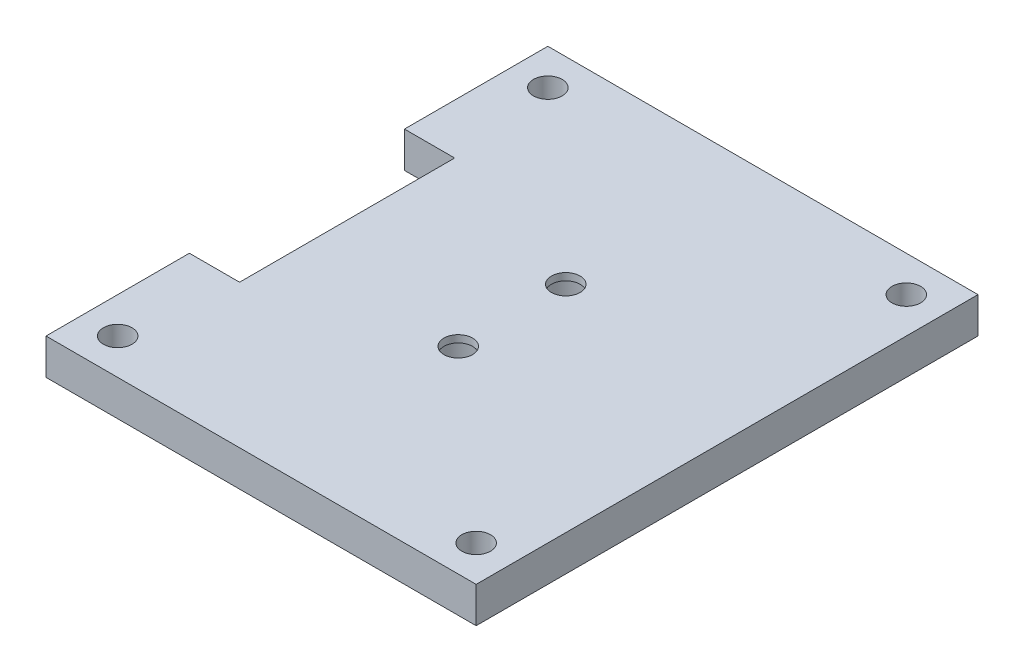
ISO-10303-21;
HEADER;
FILE_DESCRIPTION(('STEP AP214'),'2;1');
FILE_NAME('part.step','',(''),(''),'','','');
FILE_SCHEMA(('AUTOMOTIVE_DESIGN { 1 0 10303 214 1 1 1 1 }'));
ENDSEC;
DATA;
#1=APPLICATION_CONTEXT('core data for automotive mechanical design processes');
#2=APPLICATION_PROTOCOL_DEFINITION('international standard','automotive_design',2000,#1);
#3=PRODUCT_CONTEXT('',#1,'mechanical');
#4=PRODUCT('Part','Part','',(#3));
#5=PRODUCT_RELATED_PRODUCT_CATEGORY('part','',(#4));
#6=PRODUCT_DEFINITION_FORMATION('','',#4);
#7=PRODUCT_DEFINITION_CONTEXT('part definition',#1,'design');
#8=PRODUCT_DEFINITION('design','',#6,#7);
#9=PRODUCT_DEFINITION_SHAPE('','',#8);
#10=(LENGTH_UNIT() NAMED_UNIT(*) SI_UNIT(.MILLI.,.METRE.));
#11=(NAMED_UNIT(*) PLANE_ANGLE_UNIT() SI_UNIT($,.RADIAN.));
#12=(NAMED_UNIT(*) SI_UNIT($,.STERADIAN.) SOLID_ANGLE_UNIT());
#13=UNCERTAINTY_MEASURE_WITH_UNIT(LENGTH_MEASURE(1.E-05),#10,'distance_accuracy_value','');
#14=(GEOMETRIC_REPRESENTATION_CONTEXT(3) GLOBAL_UNCERTAINTY_ASSIGNED_CONTEXT((#13)) GLOBAL_UNIT_ASSIGNED_CONTEXT((#10,
#11,#12)) REPRESENTATION_CONTEXT('',''));
#15=CARTESIAN_POINT('',(0.,0.,0.));
#16=DIRECTION('',(0.,0.,1.));
#17=DIRECTION('',(1.,0.,0.));
#18=AXIS2_PLACEMENT_3D('',#15,#16,#17);
#19=CARTESIAN_POINT('',(0.,5.,-15.0000000000001));
#20=DIRECTION('',(0.,0.,-1.));
#21=DIRECTION('',(-1.,0.,0.));
#22=AXIS2_PLACEMENT_3D('',#19,#20,#21);
#23=PLANE('',#22);
#24=DIRECTION('',(1.,0.,0.));
#25=VECTOR('',#24,1.);
#26=CARTESIAN_POINT('',(0.,0.,-15.0000000000001));
#27=LINE('',#26,#25);
#28=CARTESIAN_POINT('',(-30.,0.,-15.));
#29=VERTEX_POINT('',#28);
#30=CARTESIAN_POINT('',(-23.,0.,-15.));
#31=VERTEX_POINT('',#30);
#32=EDGE_CURVE('E147',#29,#31,#27,.T.);
#33=ORIENTED_EDGE('',*,*,#32,.T.);
#34=DIRECTION('',(0.,-1.,0.));
#35=VECTOR('',#34,1.);
#36=CARTESIAN_POINT('',(-23.,5.,-15.));
#37=LINE('',#36,#35);
#38=CARTESIAN_POINT('',(-23.,5.,-15.));
#39=VERTEX_POINT('',#38);
#40=EDGE_CURVE('E11',#39,#31,#37,.T.);
#41=ORIENTED_EDGE('',*,*,#40,.F.);
#42=DIRECTION('',(1.,0.,0.));
#43=VECTOR('',#42,1.);
#44=CARTESIAN_POINT('',(0.,5.,-15.0000000000001));
#45=LINE('',#44,#43);
#46=CARTESIAN_POINT('',(-30.,5.,-15.));
#47=VERTEX_POINT('',#46);
#48=EDGE_CURVE('E209',#47,#39,#45,.T.);
#49=ORIENTED_EDGE('',*,*,#48,.F.);
#50=DIRECTION('',(0.,-1.,0.));
#51=VECTOR('',#50,1.);
#52=CARTESIAN_POINT('',(-30.,5.,-15.));
#53=LINE('',#52,#51);
#54=EDGE_CURVE('E129',#47,#29,#53,.T.);
#55=ORIENTED_EDGE('',*,*,#54,.T.);
#56=EDGE_LOOP('',(#33,#41,#49,#55));
#57=FACE_BOUND('',#56,.T.);
#58=ADVANCED_FACE('F36',(#57),#23,.F.);
#59=CARTESIAN_POINT('',(-23.,5.,0.));
#60=DIRECTION('',(1.,0.,0.));
#61=DIRECTION('',(0.,0.,-1.));
#62=AXIS2_PLACEMENT_3D('',#59,#60,#61);
#63=PLANE('',#62);
#64=DIRECTION('',(0.,0.,1.));
#65=VECTOR('',#64,1.);
#66=CARTESIAN_POINT('',(-23.,0.,0.));
#67=LINE('',#66,#65);
#68=CARTESIAN_POINT('',(-23.,0.,15.));
#69=VERTEX_POINT('',#68);
#70=EDGE_CURVE('E150',#31,#69,#67,.T.);
#71=ORIENTED_EDGE('',*,*,#70,.T.);
#72=DIRECTION('',(0.,-1.,0.));
#73=VECTOR('',#72,1.);
#74=CARTESIAN_POINT('',(-23.,5.,15.));
#75=LINE('',#74,#73);
#76=CARTESIAN_POINT('',(-23.,5.,15.));
#77=VERTEX_POINT('',#76);
#78=EDGE_CURVE('E46',#77,#69,#75,.T.);
#79=ORIENTED_EDGE('',*,*,#78,.F.);
#80=DIRECTION('',(0.,0.,1.));
#81=VECTOR('',#80,1.);
#82=CARTESIAN_POINT('',(-23.,5.,0.));
#83=LINE('',#82,#81);
#84=EDGE_CURVE('E94',#39,#77,#83,.T.);
#85=ORIENTED_EDGE('',*,*,#84,.F.);
#86=ORIENTED_EDGE('',*,*,#40,.T.);
#87=EDGE_LOOP('',(#71,#79,#85,#86));
#88=FACE_BOUND('',#87,.T.);
#89=ADVANCED_FACE('F244',(#88),#63,.F.);
#90=CARTESIAN_POINT('',(0.,5.,15.));
#91=DIRECTION('',(0.,0.,-1.));
#92=DIRECTION('',(-1.,0.,0.));
#93=AXIS2_PLACEMENT_3D('',#90,#91,#92);
#94=PLANE('',#93);
#95=DIRECTION('',(1.,0.,0.));
#96=VECTOR('',#95,1.);
#97=CARTESIAN_POINT('',(0.,0.,15.));
#98=LINE('',#97,#96);
#99=CARTESIAN_POINT('',(-30.,0.,15.));
#100=VERTEX_POINT('',#99);
#101=EDGE_CURVE('E153',#100,#69,#98,.T.);
#102=ORIENTED_EDGE('',*,*,#101,.F.);
#103=DIRECTION('',(0.,-1.,0.));
#104=VECTOR('',#103,1.);
#105=CARTESIAN_POINT('',(-30.,5.,15.));
#106=LINE('',#105,#104);
#107=CARTESIAN_POINT('',(-30.,5.,15.));
#108=VERTEX_POINT('',#107);
#109=EDGE_CURVE('E170',#108,#100,#106,.T.);
#110=ORIENTED_EDGE('',*,*,#109,.F.);
#111=DIRECTION('',(1.,0.,0.));
#112=VECTOR('',#111,1.);
#113=CARTESIAN_POINT('',(0.,5.,15.));
#114=LINE('',#113,#112);
#115=EDGE_CURVE('E212',#108,#77,#114,.T.);
#116=ORIENTED_EDGE('',*,*,#115,.T.);
#117=ORIENTED_EDGE('',*,*,#78,.T.);
#118=EDGE_LOOP('',(#102,#110,#116,#117));
#119=FACE_BOUND('',#118,.T.);
#120=ADVANCED_FACE('F242',(#119),#94,.T.);
#121=CARTESIAN_POINT('',(-30.,5.,0.));
#122=DIRECTION('',(1.,0.,0.));
#123=DIRECTION('',(0.,0.,-1.));
#124=AXIS2_PLACEMENT_3D('',#121,#122,#123);
#125=PLANE('',#124);
#126=DIRECTION('',(0.,0.,1.));
#127=VECTOR('',#126,1.);
#128=CARTESIAN_POINT('',(-30.,0.,0.));
#129=LINE('',#128,#127);
#130=CARTESIAN_POINT('',(-30.,0.,35.));
#131=VERTEX_POINT('',#130);
#132=EDGE_CURVE('E156',#100,#131,#129,.T.);
#133=ORIENTED_EDGE('',*,*,#132,.T.);
#134=DIRECTION('',(0.,-1.,0.));
#135=VECTOR('',#134,1.);
#136=CARTESIAN_POINT('',(-30.,5.,35.));
#137=LINE('',#136,#135);
#138=CARTESIAN_POINT('',(-30.,5.,35.));
#139=VERTEX_POINT('',#138);
#140=EDGE_CURVE('E167',#139,#131,#137,.T.);
#141=ORIENTED_EDGE('',*,*,#140,.F.);
#142=DIRECTION('',(0.,0.,1.));
#143=VECTOR('',#142,1.);
#144=CARTESIAN_POINT('',(-30.,5.,0.));
#145=LINE('',#144,#143);
#146=EDGE_CURVE('E131',#108,#139,#145,.T.);
#147=ORIENTED_EDGE('',*,*,#146,.F.);
#148=ORIENTED_EDGE('',*,*,#109,.T.);
#149=EDGE_LOOP('',(#133,#141,#147,#148));
#150=FACE_BOUND('',#149,.T.);
#151=ADVANCED_FACE('F218',(#150),#125,.F.);
#152=CARTESIAN_POINT('',(0.,5.,35.));
#153=DIRECTION('',(0.,0.,-1.));
#154=DIRECTION('',(-1.,0.,0.));
#155=AXIS2_PLACEMENT_3D('',#152,#153,#154);
#156=PLANE('',#155);
#157=DIRECTION('',(1.,0.,0.));
#158=VECTOR('',#157,1.);
#159=CARTESIAN_POINT('',(0.,0.,35.));
#160=LINE('',#159,#158);
#161=CARTESIAN_POINT('',(30.,0.,35.));
#162=VERTEX_POINT('',#161);
#163=EDGE_CURVE('E158',#131,#162,#160,.T.);
#164=ORIENTED_EDGE('',*,*,#163,.T.);
#165=DIRECTION('',(0.,-1.,0.));
#166=VECTOR('',#165,1.);
#167=CARTESIAN_POINT('',(30.,5.,35.));
#168=LINE('',#167,#166);
#169=CARTESIAN_POINT('',(30.,5.,35.));
#170=VERTEX_POINT('',#169);
#171=EDGE_CURVE('E119',#170,#162,#168,.T.);
#172=ORIENTED_EDGE('',*,*,#171,.F.);
#173=DIRECTION('',(1.,0.,0.));
#174=VECTOR('',#173,1.);
#175=CARTESIAN_POINT('',(0.,5.,35.));
#176=LINE('',#175,#174);
#177=EDGE_CURVE('E124',#139,#170,#176,.T.);
#178=ORIENTED_EDGE('',*,*,#177,.F.);
#179=ORIENTED_EDGE('',*,*,#140,.T.);
#180=EDGE_LOOP('',(#164,#172,#178,#179));
#181=FACE_BOUND('',#180,.T.);
#182=ADVANCED_FACE('F222',(#181),#156,.F.);
#183=CARTESIAN_POINT('',(30.,5.,0.));
#184=DIRECTION('',(1.,0.,0.));
#185=DIRECTION('',(0.,0.,-1.));
#186=AXIS2_PLACEMENT_3D('',#183,#184,#185);
#187=PLANE('',#186);
#188=DIRECTION('',(0.,0.,1.));
#189=VECTOR('',#188,1.);
#190=CARTESIAN_POINT('',(30.,0.,0.));
#191=LINE('',#190,#189);
#192=CARTESIAN_POINT('',(30.,0.,-35.));
#193=VERTEX_POINT('',#192);
#194=EDGE_CURVE('E114',#193,#162,#191,.T.);
#195=ORIENTED_EDGE('',*,*,#194,.F.);
#196=DIRECTION('',(0.,-1.,0.));
#197=VECTOR('',#196,1.);
#198=CARTESIAN_POINT('',(30.,5.,-35.));
#199=LINE('',#198,#197);
#200=CARTESIAN_POINT('',(30.,5.,-35.));
#201=VERTEX_POINT('',#200);
#202=EDGE_CURVE('E109',#201,#193,#199,.T.);
#203=ORIENTED_EDGE('',*,*,#202,.F.);
#204=DIRECTION('',(0.,0.,1.));
#205=VECTOR('',#204,1.);
#206=CARTESIAN_POINT('',(30.,5.,0.));
#207=LINE('',#206,#205);
#208=EDGE_CURVE('E112',#201,#170,#207,.T.);
#209=ORIENTED_EDGE('',*,*,#208,.T.);
#210=ORIENTED_EDGE('',*,*,#171,.T.);
#211=EDGE_LOOP('',(#195,#203,#209,#210));
#212=FACE_BOUND('',#211,.T.);
#213=ADVANCED_FACE('F111',(#212),#187,.T.);
#214=CARTESIAN_POINT('',(0.,5.,-35.));
#215=DIRECTION('',(0.,0.,-1.));
#216=DIRECTION('',(-1.,0.,0.));
#217=AXIS2_PLACEMENT_3D('',#214,#215,#216);
#218=PLANE('',#217);
#219=DIRECTION('',(1.,0.,0.));
#220=VECTOR('',#219,1.);
#221=CARTESIAN_POINT('',(0.,0.,-35.));
#222=LINE('',#221,#220);
#223=CARTESIAN_POINT('',(-30.,0.,-35.));
#224=VERTEX_POINT('',#223);
#225=EDGE_CURVE('E162',#224,#193,#222,.T.);
#226=ORIENTED_EDGE('',*,*,#225,.F.);
#227=DIRECTION('',(0.,-1.,0.));
#228=VECTOR('',#227,1.);
#229=CARTESIAN_POINT('',(-30.,5.,-35.));
#230=LINE('',#229,#228);
#231=CARTESIAN_POINT('',(-30.,5.,-35.));
#232=VERTEX_POINT('',#231);
#233=EDGE_CURVE('E83',#232,#224,#230,.T.);
#234=ORIENTED_EDGE('',*,*,#233,.F.);
#235=DIRECTION('',(1.,0.,0.));
#236=VECTOR('',#235,1.);
#237=CARTESIAN_POINT('',(0.,5.,-35.));
#238=LINE('',#237,#236);
#239=EDGE_CURVE('E122',#232,#201,#238,.T.);
#240=ORIENTED_EDGE('',*,*,#239,.T.);
#241=ORIENTED_EDGE('',*,*,#202,.T.);
#242=EDGE_LOOP('',(#226,#234,#240,#241));
#243=FACE_BOUND('',#242,.T.);
#244=ADVANCED_FACE('F127',(#243),#218,.T.);
#245=CARTESIAN_POINT('',(-25.,5.,-30.));
#246=DIRECTION('',(0.,-1.,0.));
#247=DIRECTION('',(0.,0.,-1.));
#248=AXIS2_PLACEMENT_3D('',#245,#246,#247);
#249=CYLINDRICAL_SURFACE('',#248,2.00000000000001);
#250=CARTESIAN_POINT('',(-25.,5.,-30.));
#251=DIRECTION('',(0.,1.,0.));
#252=DIRECTION('',(0.,0.,1.));
#253=AXIS2_PLACEMENT_3D('',#250,#251,#252);
#254=CIRCLE('',#253,2.00000000000001);
#255=CARTESIAN_POINT('',(-25.,5.,-28.));
#256=VERTEX_POINT('',#255);
#257=EDGE_CURVE('E206',#256,#256,#254,.T.);
#258=ORIENTED_EDGE('',*,*,#257,.T.);
#259=EDGE_LOOP('',(#258));
#260=FACE_BOUND('',#259,.T.);
#261=CARTESIAN_POINT('',(-25.,0.,-30.));
#262=DIRECTION('',(0.,1.,0.));
#263=DIRECTION('',(0.,0.,1.));
#264=AXIS2_PLACEMENT_3D('',#261,#262,#263);
#265=CIRCLE('',#264,2.00000000000001);
#266=CARTESIAN_POINT('',(-25.,0.,-28.));
#267=VERTEX_POINT('',#266);
#268=EDGE_CURVE('E144',#267,#267,#265,.T.);
#269=ORIENTED_EDGE('',*,*,#268,.F.);
#270=EDGE_LOOP('',(#269));
#271=FACE_BOUND('',#270,.T.);
#272=ADVANCED_FACE('F252',(#260,#271),#249,.F.);
#273=CARTESIAN_POINT('',(25.,5.,-30.));
#274=DIRECTION('',(0.,-1.,0.));
#275=DIRECTION('',(0.,0.,-1.));
#276=AXIS2_PLACEMENT_3D('',#273,#274,#275);
#277=CYLINDRICAL_SURFACE('',#276,2.00000000000001);
#278=CARTESIAN_POINT('',(25.,5.,-30.));
#279=DIRECTION('',(0.,1.,0.));
#280=DIRECTION('',(0.,0.,1.));
#281=AXIS2_PLACEMENT_3D('',#278,#279,#280);
#282=CIRCLE('',#281,2.00000000000001);
#283=CARTESIAN_POINT('',(25.,5.,-28.));
#284=VERTEX_POINT('',#283);
#285=EDGE_CURVE('E203',#284,#284,#282,.T.);
#286=ORIENTED_EDGE('',*,*,#285,.T.);
#287=EDGE_LOOP('',(#286));
#288=FACE_BOUND('',#287,.T.);
#289=CARTESIAN_POINT('',(25.,0.,-30.));
#290=DIRECTION('',(0.,1.,0.));
#291=DIRECTION('',(0.,0.,1.));
#292=AXIS2_PLACEMENT_3D('',#289,#290,#291);
#293=CIRCLE('',#292,2.00000000000001);
#294=CARTESIAN_POINT('',(25.,0.,-28.));
#295=VERTEX_POINT('',#294);
#296=EDGE_CURVE('E141',#295,#295,#293,.T.);
#297=ORIENTED_EDGE('',*,*,#296,.F.);
#298=EDGE_LOOP('',(#297));
#299=FACE_BOUND('',#298,.T.);
#300=ADVANCED_FACE('F255',(#288,#299),#277,.F.);
#301=CARTESIAN_POINT('',(25.,5.,30.));
#302=DIRECTION('',(0.,-1.,0.));
#303=DIRECTION('',(0.,0.,-1.));
#304=AXIS2_PLACEMENT_3D('',#301,#302,#303);
#305=CYLINDRICAL_SURFACE('',#304,2.00000000000001);
#306=CARTESIAN_POINT('',(25.,5.,30.));
#307=DIRECTION('',(0.,1.,0.));
#308=DIRECTION('',(0.,0.,1.));
#309=AXIS2_PLACEMENT_3D('',#306,#307,#308);
#310=CIRCLE('',#309,2.00000000000001);
#311=CARTESIAN_POINT('',(25.,5.,32.));
#312=VERTEX_POINT('',#311);
#313=EDGE_CURVE('E200',#312,#312,#310,.T.);
#314=ORIENTED_EDGE('',*,*,#313,.T.);
#315=EDGE_LOOP('',(#314));
#316=FACE_BOUND('',#315,.T.);
#317=CARTESIAN_POINT('',(25.,0.,30.));
#318=DIRECTION('',(0.,1.,0.));
#319=DIRECTION('',(0.,0.,1.));
#320=AXIS2_PLACEMENT_3D('',#317,#318,#319);
#321=CIRCLE('',#320,2.00000000000001);
#322=CARTESIAN_POINT('',(25.,0.,32.));
#323=VERTEX_POINT('',#322);
#324=EDGE_CURVE('E137',#323,#323,#321,.T.);
#325=ORIENTED_EDGE('',*,*,#324,.F.);
#326=EDGE_LOOP('',(#325));
#327=FACE_BOUND('',#326,.T.);
#328=ADVANCED_FACE('F237',(#316,#327),#305,.F.);
#329=CARTESIAN_POINT('',(-25.,5.,30.));
#330=DIRECTION('',(0.,-1.,0.));
#331=DIRECTION('',(0.,0.,-1.));
#332=AXIS2_PLACEMENT_3D('',#329,#330,#331);
#333=CYLINDRICAL_SURFACE('',#332,2.00000000000001);
#334=CARTESIAN_POINT('',(-25.,5.,30.));
#335=DIRECTION('',(0.,1.,0.));
#336=DIRECTION('',(0.,0.,1.));
#337=AXIS2_PLACEMENT_3D('',#334,#335,#336);
#338=CIRCLE('',#337,2.00000000000001);
#339=CARTESIAN_POINT('',(-25.,5.,32.));
#340=VERTEX_POINT('',#339);
#341=EDGE_CURVE('E197',#340,#340,#338,.T.);
#342=ORIENTED_EDGE('',*,*,#341,.T.);
#343=EDGE_LOOP('',(#342));
#344=FACE_BOUND('',#343,.T.);
#345=CARTESIAN_POINT('',(-25.,0.,30.));
#346=DIRECTION('',(0.,1.,0.));
#347=DIRECTION('',(0.,0.,1.));
#348=AXIS2_PLACEMENT_3D('',#345,#346,#347);
#349=CIRCLE('',#348,2.00000000000001);
#350=CARTESIAN_POINT('',(-25.,0.,32.));
#351=VERTEX_POINT('',#350);
#352=EDGE_CURVE('E134',#351,#351,#349,.T.);
#353=ORIENTED_EDGE('',*,*,#352,.F.);
#354=EDGE_LOOP('',(#353));
#355=FACE_BOUND('',#354,.T.);
#356=ADVANCED_FACE('F38',(#344,#355),#333,.F.);
#357=EDGE_CURVE('E86',#224,#29,#129,.T.);
#358=ORIENTED_EDGE('',*,*,#357,.T.);
#359=ORIENTED_EDGE('',*,*,#54,.F.);
#360=EDGE_CURVE('E55',#232,#47,#145,.T.);
#361=ORIENTED_EDGE('',*,*,#360,.F.);
#362=ORIENTED_EDGE('',*,*,#233,.T.);
#363=EDGE_LOOP('',(#358,#359,#361,#362));
#364=FACE_BOUND('',#363,.T.);
#365=ADVANCED_FACE('F229',(#364),#125,.F.);
#366=CARTESIAN_POINT('',(0.,5.,0.));
#367=DIRECTION('',(0.,1.,0.));
#368=DIRECTION('',(0.,0.,1.));
#369=AXIS2_PLACEMENT_3D('',#366,#367,#368);
#370=PLANE('',#369);
#371=CARTESIAN_POINT('',(0.,5.,-7.5));
#372=DIRECTION('',(0.,-1.,0.));
#373=DIRECTION('',(0.,0.,-1.));
#374=AXIS2_PLACEMENT_3D('',#371,#372,#373);
#375=CIRCLE('',#374,2.);
#376=CARTESIAN_POINT('',(0.,5.,-9.5));
#377=VERTEX_POINT('',#376);
#378=EDGE_CURVE('E174',#377,#377,#375,.T.);
#379=ORIENTED_EDGE('',*,*,#378,.T.);
#380=EDGE_LOOP('',(#379));
#381=FACE_BOUND('',#380,.T.);
#382=CARTESIAN_POINT('',(0.,5.,7.5));
#383=DIRECTION('',(0.,-1.,0.));
#384=DIRECTION('',(0.,0.,-1.));
#385=AXIS2_PLACEMENT_3D('',#382,#383,#384);
#386=CIRCLE('',#385,2.);
#387=CARTESIAN_POINT('',(0.,5.,5.5));
#388=VERTEX_POINT('',#387);
#389=EDGE_CURVE('E180',#388,#388,#386,.T.);
#390=ORIENTED_EDGE('',*,*,#389,.T.);
#391=EDGE_LOOP('',(#390));
#392=FACE_BOUND('',#391,.T.);
#393=ORIENTED_EDGE('',*,*,#341,.F.);
#394=EDGE_LOOP('',(#393));
#395=FACE_BOUND('',#394,.T.);
#396=ORIENTED_EDGE('',*,*,#313,.F.);
#397=EDGE_LOOP('',(#396));
#398=FACE_BOUND('',#397,.T.);
#399=ORIENTED_EDGE('',*,*,#285,.F.);
#400=EDGE_LOOP('',(#399));
#401=FACE_BOUND('',#400,.T.);
#402=ORIENTED_EDGE('',*,*,#257,.F.);
#403=EDGE_LOOP('',(#402));
#404=FACE_BOUND('',#403,.T.);
#405=ORIENTED_EDGE('',*,*,#48,.T.);
#406=ORIENTED_EDGE('',*,*,#84,.T.);
#407=ORIENTED_EDGE('',*,*,#115,.F.);
#408=ORIENTED_EDGE('',*,*,#146,.T.);
#409=ORIENTED_EDGE('',*,*,#177,.T.);
#410=ORIENTED_EDGE('',*,*,#208,.F.);
#411=ORIENTED_EDGE('',*,*,#239,.F.);
#412=ORIENTED_EDGE('',*,*,#360,.T.);
#413=EDGE_LOOP('',(#405,#406,#407,#408,#409,#410,#411,#412));
#414=FACE_BOUND('',#413,.T.);
#415=ADVANCED_FACE('F121',(#381,#392,#395,#398,#401,#404,#414),#370,.T.);
#416=CARTESIAN_POINT('',(0.,0.,0.));
#417=DIRECTION('',(0.,1.,0.));
#418=DIRECTION('',(0.,0.,1.));
#419=AXIS2_PLACEMENT_3D('',#416,#417,#418);
#420=PLANE('',#419);
#421=CARTESIAN_POINT('',(0.,0.,-7.5));
#422=DIRECTION('',(0.,-1.,0.));
#423=DIRECTION('',(0.,0.,-1.));
#424=AXIS2_PLACEMENT_3D('',#421,#422,#423);
#425=CIRCLE('',#424,4.);
#426=CARTESIAN_POINT('',(0.,0.,-11.5));
#427=VERTEX_POINT('',#426);
#428=EDGE_CURVE('E189',#427,#427,#425,.T.);
#429=ORIENTED_EDGE('',*,*,#428,.F.);
#430=EDGE_LOOP('',(#429));
#431=FACE_BOUND('',#430,.T.);
#432=CARTESIAN_POINT('',(0.,0.,7.5));
#433=DIRECTION('',(0.,-1.,0.));
#434=DIRECTION('',(0.,0.,-1.));
#435=AXIS2_PLACEMENT_3D('',#432,#433,#434);
#436=CIRCLE('',#435,4.);
#437=CARTESIAN_POINT('',(0.,0.,3.5));
#438=VERTEX_POINT('',#437);
#439=EDGE_CURVE('E178',#438,#438,#436,.T.);
#440=ORIENTED_EDGE('',*,*,#439,.F.);
#441=EDGE_LOOP('',(#440));
#442=FACE_BOUND('',#441,.T.);
#443=ORIENTED_EDGE('',*,*,#352,.T.);
#444=EDGE_LOOP('',(#443));
#445=FACE_BOUND('',#444,.T.);
#446=ORIENTED_EDGE('',*,*,#324,.T.);
#447=EDGE_LOOP('',(#446));
#448=FACE_BOUND('',#447,.T.);
#449=ORIENTED_EDGE('',*,*,#296,.T.);
#450=EDGE_LOOP('',(#449));
#451=FACE_BOUND('',#450,.T.);
#452=ORIENTED_EDGE('',*,*,#268,.T.);
#453=EDGE_LOOP('',(#452));
#454=FACE_BOUND('',#453,.T.);
#455=ORIENTED_EDGE('',*,*,#32,.F.);
#456=ORIENTED_EDGE('',*,*,#357,.F.);
#457=ORIENTED_EDGE('',*,*,#225,.T.);
#458=ORIENTED_EDGE('',*,*,#194,.T.);
#459=ORIENTED_EDGE('',*,*,#163,.F.);
#460=ORIENTED_EDGE('',*,*,#132,.F.);
#461=ORIENTED_EDGE('',*,*,#101,.T.);
#462=ORIENTED_EDGE('',*,*,#70,.F.);
#463=EDGE_LOOP('',(#455,#456,#457,#458,#459,#460,#461,#462));
#464=FACE_BOUND('',#463,.T.);
#465=ADVANCED_FACE('F225',(#431,#442,#445,#448,#451,#454,#464),#420,.F.);
#466=CARTESIAN_POINT('',(0.,4.,7.5));
#467=DIRECTION('',(0.,-1.,0.));
#468=DIRECTION('',(0.,0.,-1.));
#469=AXIS2_PLACEMENT_3D('',#466,#467,#468);
#470=CYLINDRICAL_SURFACE('',#469,4.);
#471=CARTESIAN_POINT('',(0.,4.,7.5));
#472=DIRECTION('',(0.,-1.,0.));
#473=DIRECTION('',(0.,0.,-1.));
#474=AXIS2_PLACEMENT_3D('',#471,#472,#473);
#475=CIRCLE('',#474,4.);
#476=CARTESIAN_POINT('',(0.,4.,3.5));
#477=VERTEX_POINT('',#476);
#478=EDGE_CURVE('E192',#477,#477,#475,.T.);
#479=ORIENTED_EDGE('',*,*,#478,.F.);
#480=EDGE_LOOP('',(#479));
#481=FACE_BOUND('',#480,.T.);
#482=ORIENTED_EDGE('',*,*,#439,.T.);
#483=EDGE_LOOP('',(#482));
#484=FACE_BOUND('',#483,.T.);
#485=ADVANCED_FACE('F269',(#481,#484),#470,.F.);
#486=CARTESIAN_POINT('',(0.,4.,0.));
#487=DIRECTION('',(0.,-1.,0.));
#488=DIRECTION('',(0.,0.,-1.));
#489=AXIS2_PLACEMENT_3D('',#486,#487,#488);
#490=PLANE('',#489);
#491=CARTESIAN_POINT('',(0.,4.,7.5));
#492=DIRECTION('',(0.,-1.,0.));
#493=DIRECTION('',(0.,0.,-1.));
#494=AXIS2_PLACEMENT_3D('',#491,#492,#493);
#495=CIRCLE('',#494,2.);
#496=CARTESIAN_POINT('',(0.,4.,5.5));
#497=VERTEX_POINT('',#496);
#498=EDGE_CURVE('E40',#497,#497,#495,.T.);
#499=ORIENTED_EDGE('',*,*,#498,.F.);
#500=EDGE_LOOP('',(#499));
#501=FACE_BOUND('',#500,.T.);
#502=ORIENTED_EDGE('',*,*,#478,.T.);
#503=EDGE_LOOP('',(#502));
#504=FACE_BOUND('',#503,.T.);
#505=ADVANCED_FACE('F279',(#501,#504),#490,.T.);
#506=CARTESIAN_POINT('',(0.,4.,-7.5));
#507=DIRECTION('',(0.,-1.,0.));
#508=DIRECTION('',(0.,0.,-1.));
#509=AXIS2_PLACEMENT_3D('',#506,#507,#508);
#510=CYLINDRICAL_SURFACE('',#509,4.);
#511=CARTESIAN_POINT('',(0.,4.,-7.5));
#512=DIRECTION('',(0.,-1.,0.));
#513=DIRECTION('',(0.,0.,-1.));
#514=AXIS2_PLACEMENT_3D('',#511,#512,#513);
#515=CIRCLE('',#514,4.);
#516=CARTESIAN_POINT('',(0.,4.,-11.5));
#517=VERTEX_POINT('',#516);
#518=EDGE_CURVE('E138',#517,#517,#515,.T.);
#519=ORIENTED_EDGE('',*,*,#518,.F.);
#520=EDGE_LOOP('',(#519));
#521=FACE_BOUND('',#520,.T.);
#522=ORIENTED_EDGE('',*,*,#428,.T.);
#523=EDGE_LOOP('',(#522));
#524=FACE_BOUND('',#523,.T.);
#525=ADVANCED_FACE('F287',(#521,#524),#510,.F.);
#526=CARTESIAN_POINT('',(0.,4.,0.));
#527=DIRECTION('',(0.,-1.,0.));
#528=DIRECTION('',(0.,0.,-1.));
#529=AXIS2_PLACEMENT_3D('',#526,#527,#528);
#530=PLANE('',#529);
#531=CARTESIAN_POINT('',(0.,4.,-7.5));
#532=DIRECTION('',(0.,-1.,0.));
#533=DIRECTION('',(0.,0.,-1.));
#534=AXIS2_PLACEMENT_3D('',#531,#532,#533);
#535=CIRCLE('',#534,2.);
#536=CARTESIAN_POINT('',(0.,4.,-9.5));
#537=VERTEX_POINT('',#536);
#538=EDGE_CURVE('E172',#537,#537,#535,.T.);
#539=ORIENTED_EDGE('',*,*,#538,.F.);
#540=EDGE_LOOP('',(#539));
#541=FACE_BOUND('',#540,.T.);
#542=ORIENTED_EDGE('',*,*,#518,.T.);
#543=EDGE_LOOP('',(#542));
#544=FACE_BOUND('',#543,.T.);
#545=ADVANCED_FACE('F291',(#541,#544),#530,.T.);
#546=CARTESIAN_POINT('',(0.,5.,-7.5));
#547=DIRECTION('',(0.,-1.,0.));
#548=DIRECTION('',(0.,0.,-1.));
#549=AXIS2_PLACEMENT_3D('',#546,#547,#548);
#550=CYLINDRICAL_SURFACE('',#549,2.);
#551=ORIENTED_EDGE('',*,*,#538,.T.);
#552=EDGE_LOOP('',(#551));
#553=FACE_BOUND('',#552,.T.);
#554=ORIENTED_EDGE('',*,*,#378,.F.);
#555=EDGE_LOOP('',(#554));
#556=FACE_BOUND('',#555,.T.);
#557=ADVANCED_FACE('F295',(#553,#556),#550,.F.);
#558=CARTESIAN_POINT('',(0.,5.,7.5));
#559=DIRECTION('',(0.,-1.,0.));
#560=DIRECTION('',(0.,0.,-1.));
#561=AXIS2_PLACEMENT_3D('',#558,#559,#560);
#562=CYLINDRICAL_SURFACE('',#561,2.);
#563=ORIENTED_EDGE('',*,*,#498,.T.);
#564=EDGE_LOOP('',(#563));
#565=FACE_BOUND('',#564,.T.);
#566=ORIENTED_EDGE('',*,*,#389,.F.);
#567=EDGE_LOOP('',(#566));
#568=FACE_BOUND('',#567,.T.);
#569=ADVANCED_FACE('F297',(#565,#568),#562,.F.);
#570=CLOSED_SHELL('',(#58,#89,#120,#151,#182,#213,#244,#272,#300,#328,#356,#365,#415,#465,#485,
#505,#525,#545,#557,#569));
#571=MANIFOLD_SOLID_BREP('B2',#570);
#572=ADVANCED_BREP_SHAPE_REPRESENTATION('',(#18,#571),#14);
#573=SHAPE_DEFINITION_REPRESENTATION(#9,#572);
ENDSEC;
END-ISO-10303-21;
